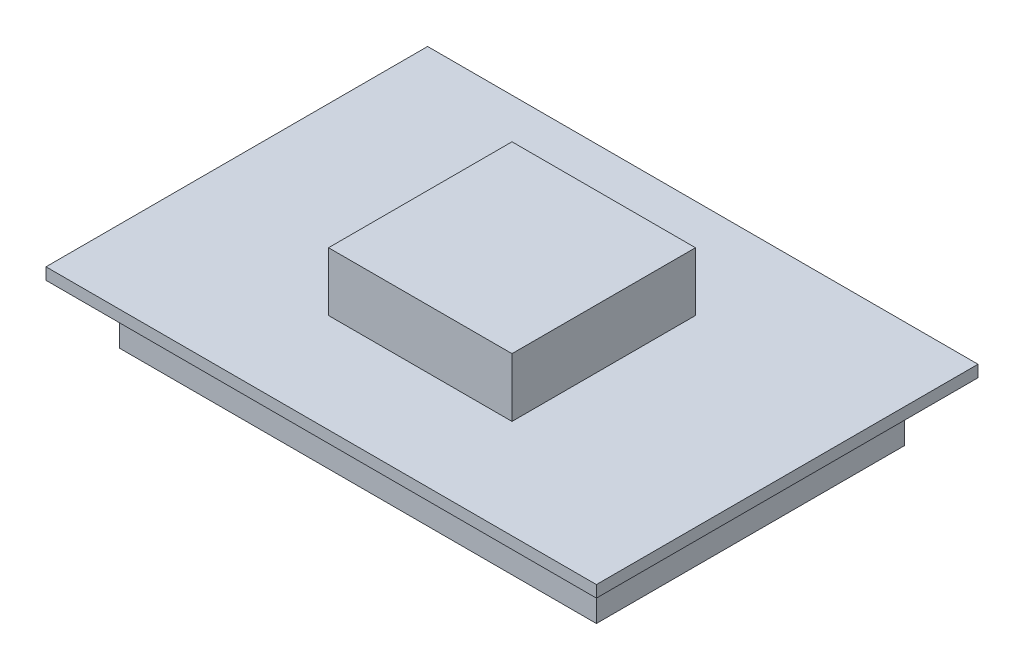
ISO-10303-21;
HEADER;
FILE_DESCRIPTION(('STEP AP214'),'2;1');
FILE_NAME('part.step','',(''),(''),'','','');
FILE_SCHEMA(('AUTOMOTIVE_DESIGN { 1 0 10303 214 1 1 1 1 }'));
ENDSEC;
DATA;
#1=APPLICATION_CONTEXT('core data for automotive mechanical design processes');
#2=APPLICATION_PROTOCOL_DEFINITION('international standard','automotive_design',2000,#1);
#3=PRODUCT_CONTEXT('',#1,'mechanical');
#4=PRODUCT('Part','Part','',(#3));
#5=PRODUCT_RELATED_PRODUCT_CATEGORY('part','',(#4));
#6=PRODUCT_DEFINITION_FORMATION('','',#4);
#7=PRODUCT_DEFINITION_CONTEXT('part definition',#1,'design');
#8=PRODUCT_DEFINITION('design','',#6,#7);
#9=PRODUCT_DEFINITION_SHAPE('','',#8);
#10=(LENGTH_UNIT() NAMED_UNIT(*) SI_UNIT(.MILLI.,.METRE.));
#11=(NAMED_UNIT(*) PLANE_ANGLE_UNIT() SI_UNIT($,.RADIAN.));
#12=(NAMED_UNIT(*) SI_UNIT($,.STERADIAN.) SOLID_ANGLE_UNIT());
#13=UNCERTAINTY_MEASURE_WITH_UNIT(LENGTH_MEASURE(1.E-05),#10,'distance_accuracy_value','');
#14=(GEOMETRIC_REPRESENTATION_CONTEXT(3) GLOBAL_UNCERTAINTY_ASSIGNED_CONTEXT((#13)) GLOBAL_UNIT_ASSIGNED_CONTEXT((#10,
#11,#12)) REPRESENTATION_CONTEXT('',''));
#15=CARTESIAN_POINT('',(0.,0.,0.));
#16=DIRECTION('',(0.,0.,1.));
#17=DIRECTION('',(1.,0.,0.));
#18=AXIS2_PLACEMENT_3D('',#15,#16,#17);
#19=CARTESIAN_POINT('',(-46.,-12.4,97.));
#20=DIRECTION('',(1.,0.,0.));
#21=DIRECTION('',(0.,0.,-1.));
#22=AXIS2_PLACEMENT_3D('',#19,#20,#21);
#23=PLANE('',#22);
#24=DIRECTION('',(0.,0.,1.));
#25=VECTOR('',#24,1.);
#26=CARTESIAN_POINT('',(-46.,-14.,97.));
#27=LINE('',#26,#25);
#28=CARTESIAN_POINT('',(-46.,-14.,97.));
#29=VERTEX_POINT('',#28);
#30=CARTESIAN_POINT('',(-46.,-14.,149.));
#31=VERTEX_POINT('',#30);
#32=EDGE_CURVE('E196',#29,#31,#27,.T.);
#33=ORIENTED_EDGE('',*,*,#32,.T.);
#34=DIRECTION('',(0.,-1.,0.));
#35=VECTOR('',#34,1.);
#36=CARTESIAN_POINT('',(-46.,-12.4,149.));
#37=LINE('',#36,#35);
#38=CARTESIAN_POINT('',(-46.,-12.4,149.));
#39=VERTEX_POINT('',#38);
#40=EDGE_CURVE('E11',#39,#31,#37,.T.);
#41=ORIENTED_EDGE('',*,*,#40,.F.);
#42=DIRECTION('',(0.,0.,1.));
#43=VECTOR('',#42,1.);
#44=CARTESIAN_POINT('',(-46.,-12.4,97.));
#45=LINE('',#44,#43);
#46=CARTESIAN_POINT('',(-46.,-12.4,97.));
#47=VERTEX_POINT('',#46);
#48=EDGE_CURVE('E197',#47,#39,#45,.T.);
#49=ORIENTED_EDGE('',*,*,#48,.F.);
#50=DIRECTION('',(0.,-1.,0.));
#51=VECTOR('',#50,1.);
#52=CARTESIAN_POINT('',(-46.,-12.4,97.));
#53=LINE('',#52,#51);
#54=EDGE_CURVE('E207',#47,#29,#53,.T.);
#55=ORIENTED_EDGE('',*,*,#54,.T.);
#56=EDGE_LOOP('',(#33,#41,#49,#55));
#57=FACE_BOUND('',#56,.T.);
#58=ADVANCED_FACE('F39',(#57),#23,.F.);
#59=CARTESIAN_POINT('',(-46.,-12.4,149.));
#60=DIRECTION('',(0.,0.,-1.));
#61=DIRECTION('',(-1.,0.,0.));
#62=AXIS2_PLACEMENT_3D('',#59,#60,#61);
#63=PLANE('',#62);
#64=DIRECTION('',(1.,0.,0.));
#65=VECTOR('',#64,1.);
#66=CARTESIAN_POINT('',(-46.,-14.,149.));
#67=LINE('',#66,#65);
#68=CARTESIAN_POINT('',(29.,-14.,149.));
#69=VERTEX_POINT('',#68);
#70=EDGE_CURVE('E210',#31,#69,#67,.T.);
#71=ORIENTED_EDGE('',*,*,#70,.T.);
#72=DIRECTION('',(0.,-1.,0.));
#73=VECTOR('',#72,1.);
#74=CARTESIAN_POINT('',(29.,-12.4,149.));
#75=LINE('',#74,#73);
#76=CARTESIAN_POINT('',(29.,-12.4,149.));
#77=VERTEX_POINT('',#76);
#78=EDGE_CURVE('E46',#77,#69,#75,.T.);
#79=ORIENTED_EDGE('',*,*,#78,.F.);
#80=DIRECTION('',(1.,0.,0.));
#81=VECTOR('',#80,1.);
#82=CARTESIAN_POINT('',(-46.,-12.4,149.));
#83=LINE('',#82,#81);
#84=EDGE_CURVE('E200',#39,#77,#83,.T.);
#85=ORIENTED_EDGE('',*,*,#84,.F.);
#86=ORIENTED_EDGE('',*,*,#40,.T.);
#87=EDGE_LOOP('',(#71,#79,#85,#86));
#88=FACE_BOUND('',#87,.T.);
#89=ADVANCED_FACE('F238',(#88),#63,.F.);
#90=CARTESIAN_POINT('',(29.,-12.4,149.));
#91=DIRECTION('',(-1.,0.,0.));
#92=DIRECTION('',(0.,0.,1.));
#93=AXIS2_PLACEMENT_3D('',#90,#91,#92);
#94=PLANE('',#93);
#95=DIRECTION('',(0.,0.,-1.));
#96=VECTOR('',#95,1.);
#97=CARTESIAN_POINT('',(29.,-14.,149.));
#98=LINE('',#97,#96);
#99=CARTESIAN_POINT('',(29.,-14.,97.));
#100=VERTEX_POINT('',#99);
#101=EDGE_CURVE('E212',#69,#100,#98,.T.);
#102=ORIENTED_EDGE('',*,*,#101,.T.);
#103=DIRECTION('',(0.,-1.,0.));
#104=VECTOR('',#103,1.);
#105=CARTESIAN_POINT('',(29.,-12.4,97.));
#106=LINE('',#105,#104);
#107=CARTESIAN_POINT('',(29.,-12.4,97.));
#108=VERTEX_POINT('',#107);
#109=EDGE_CURVE('E217',#108,#100,#106,.T.);
#110=ORIENTED_EDGE('',*,*,#109,.F.);
#111=DIRECTION('',(0.,0.,-1.));
#112=VECTOR('',#111,1.);
#113=CARTESIAN_POINT('',(29.,-12.4,149.));
#114=LINE('',#113,#112);
#115=EDGE_CURVE('E203',#77,#108,#114,.T.);
#116=ORIENTED_EDGE('',*,*,#115,.F.);
#117=ORIENTED_EDGE('',*,*,#78,.T.);
#118=EDGE_LOOP('',(#102,#110,#116,#117));
#119=FACE_BOUND('',#118,.T.);
#120=ADVANCED_FACE('F224',(#119),#94,.F.);
#121=CARTESIAN_POINT('',(29.,-12.4,97.));
#122=DIRECTION('',(0.,0.,1.));
#123=DIRECTION('',(1.,0.,0.));
#124=AXIS2_PLACEMENT_3D('',#121,#122,#123);
#125=PLANE('',#124);
#126=DIRECTION('',(-1.,0.,0.));
#127=VECTOR('',#126,1.);
#128=CARTESIAN_POINT('',(29.,-14.,97.));
#129=LINE('',#128,#127);
#130=EDGE_CURVE('E201',#100,#29,#129,.T.);
#131=ORIENTED_EDGE('',*,*,#130,.T.);
#132=ORIENTED_EDGE('',*,*,#54,.F.);
#133=DIRECTION('',(-1.,0.,0.));
#134=VECTOR('',#133,1.);
#135=CARTESIAN_POINT('',(29.,-12.4,97.));
#136=LINE('',#135,#134);
#137=EDGE_CURVE('E205',#108,#47,#136,.T.);
#138=ORIENTED_EDGE('',*,*,#137,.F.);
#139=ORIENTED_EDGE('',*,*,#109,.T.);
#140=EDGE_LOOP('',(#131,#132,#138,#139));
#141=FACE_BOUND('',#140,.T.);
#142=ADVANCED_FACE('F231',(#141),#125,.F.);
#143=CARTESIAN_POINT('',(0.,-12.4,0.));
#144=DIRECTION('',(0.,1.,0.));
#145=DIRECTION('',(0.,0.,1.));
#146=AXIS2_PLACEMENT_3D('',#143,#144,#145);
#147=PLANE('',#146);
#148=DIRECTION('',(0.,0.,1.));
#149=VECTOR('',#148,1.);
#150=CARTESIAN_POINT('',(-21.,-12.4,110.5));
#151=LINE('',#150,#149);
#152=CARTESIAN_POINT('',(-21.,-12.4,110.5));
#153=VERTEX_POINT('',#152);
#154=CARTESIAN_POINT('',(-21.,-12.4,135.5));
#155=VERTEX_POINT('',#154);
#156=EDGE_CURVE('E61',#153,#155,#151,.T.);
#157=ORIENTED_EDGE('',*,*,#156,.F.);
#158=DIRECTION('',(-1.,0.,0.));
#159=VECTOR('',#158,1.);
#160=CARTESIAN_POINT('',(4.,-12.4,110.5));
#161=LINE('',#160,#159);
#162=CARTESIAN_POINT('',(4.,-12.4,110.5));
#163=VERTEX_POINT('',#162);
#164=EDGE_CURVE('E170',#163,#153,#161,.T.);
#165=ORIENTED_EDGE('',*,*,#164,.F.);
#166=DIRECTION('',(0.,0.,-1.));
#167=VECTOR('',#166,1.);
#168=CARTESIAN_POINT('',(4.,-12.4,135.5));
#169=LINE('',#168,#167);
#170=CARTESIAN_POINT('',(4.,-12.4,135.5));
#171=VERTEX_POINT('',#170);
#172=EDGE_CURVE('E181',#171,#163,#169,.T.);
#173=ORIENTED_EDGE('',*,*,#172,.F.);
#174=DIRECTION('',(1.,0.,0.));
#175=VECTOR('',#174,1.);
#176=CARTESIAN_POINT('',(-21.,-12.4,135.5));
#177=LINE('',#176,#175);
#178=EDGE_CURVE('E178',#155,#171,#177,.T.);
#179=ORIENTED_EDGE('',*,*,#178,.F.);
#180=EDGE_LOOP('',(#157,#165,#173,#179));
#181=FACE_BOUND('',#180,.T.);
#182=ORIENTED_EDGE('',*,*,#48,.T.);
#183=ORIENTED_EDGE('',*,*,#84,.T.);
#184=ORIENTED_EDGE('',*,*,#115,.T.);
#185=ORIENTED_EDGE('',*,*,#137,.T.);
#186=EDGE_LOOP('',(#182,#183,#184,#185));
#187=FACE_BOUND('',#186,.T.);
#188=ADVANCED_FACE('F237',(#181,#187),#147,.T.);
#189=CARTESIAN_POINT('',(0.,-14.,0.));
#190=DIRECTION('',(0.,1.,0.));
#191=DIRECTION('',(0.,0.,1.));
#192=AXIS2_PLACEMENT_3D('',#189,#190,#191);
#193=PLANE('',#192);
#194=DIRECTION('',(-1.,0.,0.));
#195=VECTOR('',#194,1.);
#196=CARTESIAN_POINT('',(24.,-14.,102.));
#197=LINE('',#196,#195);
#198=CARTESIAN_POINT('',(24.,-14.,102.));
#199=VERTEX_POINT('',#198);
#200=CARTESIAN_POINT('',(-41.,-14.,102.));
#201=VERTEX_POINT('',#200);
#202=EDGE_CURVE('E148',#199,#201,#197,.T.);
#203=ORIENTED_EDGE('',*,*,#202,.T.);
#204=DIRECTION('',(0.,0.,1.));
#205=VECTOR('',#204,1.);
#206=CARTESIAN_POINT('',(-41.,-14.,102.));
#207=LINE('',#206,#205);
#208=CARTESIAN_POINT('',(-41.,-14.,144.));
#209=VERTEX_POINT('',#208);
#210=EDGE_CURVE('E53',#201,#209,#207,.T.);
#211=ORIENTED_EDGE('',*,*,#210,.T.);
#212=DIRECTION('',(1.,0.,0.));
#213=VECTOR('',#212,1.);
#214=CARTESIAN_POINT('',(-41.,-14.,144.));
#215=LINE('',#214,#213);
#216=CARTESIAN_POINT('',(24.,-14.,144.));
#217=VERTEX_POINT('',#216);
#218=EDGE_CURVE('E129',#209,#217,#215,.T.);
#219=ORIENTED_EDGE('',*,*,#218,.T.);
#220=DIRECTION('',(0.,0.,-1.));
#221=VECTOR('',#220,1.);
#222=CARTESIAN_POINT('',(24.,-14.,144.));
#223=LINE('',#222,#221);
#224=EDGE_CURVE('E138',#217,#199,#223,.T.);
#225=ORIENTED_EDGE('',*,*,#224,.T.);
#226=EDGE_LOOP('',(#203,#211,#219,#225));
#227=FACE_BOUND('',#226,.T.);
#228=ORIENTED_EDGE('',*,*,#32,.F.);
#229=ORIENTED_EDGE('',*,*,#130,.F.);
#230=ORIENTED_EDGE('',*,*,#101,.F.);
#231=ORIENTED_EDGE('',*,*,#70,.F.);
#232=EDGE_LOOP('',(#228,#229,#230,#231));
#233=FACE_BOUND('',#232,.T.);
#234=ADVANCED_FACE('F145',(#227,#233),#193,.F.);
#235=CARTESIAN_POINT('',(-21.,-4.4,110.5));
#236=DIRECTION('',(1.,0.,0.));
#237=DIRECTION('',(0.,0.,-1.));
#238=AXIS2_PLACEMENT_3D('',#235,#236,#237);
#239=PLANE('',#238);
#240=ORIENTED_EDGE('',*,*,#156,.T.);
#241=DIRECTION('',(0.,-1.,0.));
#242=VECTOR('',#241,1.);
#243=CARTESIAN_POINT('',(-21.,-4.4,135.5));
#244=LINE('',#243,#242);
#245=CARTESIAN_POINT('',(-21.,-4.4,135.5));
#246=VERTEX_POINT('',#245);
#247=EDGE_CURVE('E193',#246,#155,#244,.T.);
#248=ORIENTED_EDGE('',*,*,#247,.F.);
#249=DIRECTION('',(0.,0.,1.));
#250=VECTOR('',#249,1.);
#251=CARTESIAN_POINT('',(-21.,-4.4,110.5));
#252=LINE('',#251,#250);
#253=CARTESIAN_POINT('',(-21.,-4.4,110.5));
#254=VERTEX_POINT('',#253);
#255=EDGE_CURVE('E166',#254,#246,#252,.T.);
#256=ORIENTED_EDGE('',*,*,#255,.F.);
#257=DIRECTION('',(0.,-1.,0.));
#258=VECTOR('',#257,1.);
#259=CARTESIAN_POINT('',(-21.,-4.4,110.5));
#260=LINE('',#259,#258);
#261=EDGE_CURVE('E176',#254,#153,#260,.T.);
#262=ORIENTED_EDGE('',*,*,#261,.T.);
#263=EDGE_LOOP('',(#240,#248,#256,#262));
#264=FACE_BOUND('',#263,.T.);
#265=ADVANCED_FACE('F250',(#264),#239,.F.);
#266=CARTESIAN_POINT('',(-21.,-4.4,135.5));
#267=DIRECTION('',(0.,0.,-1.));
#268=DIRECTION('',(-1.,0.,0.));
#269=AXIS2_PLACEMENT_3D('',#266,#267,#268);
#270=PLANE('',#269);
#271=ORIENTED_EDGE('',*,*,#178,.T.);
#272=DIRECTION('',(0.,-1.,0.));
#273=VECTOR('',#272,1.);
#274=CARTESIAN_POINT('',(4.,-4.4,135.5));
#275=LINE('',#274,#273);
#276=CARTESIAN_POINT('',(4.,-4.4,135.5));
#277=VERTEX_POINT('',#276);
#278=EDGE_CURVE('E190',#277,#171,#275,.T.);
#279=ORIENTED_EDGE('',*,*,#278,.F.);
#280=DIRECTION('',(1.,0.,0.));
#281=VECTOR('',#280,1.);
#282=CARTESIAN_POINT('',(-21.,-4.4,135.5));
#283=LINE('',#282,#281);
#284=EDGE_CURVE('E169',#246,#277,#283,.T.);
#285=ORIENTED_EDGE('',*,*,#284,.F.);
#286=ORIENTED_EDGE('',*,*,#247,.T.);
#287=EDGE_LOOP('',(#271,#279,#285,#286));
#288=FACE_BOUND('',#287,.T.);
#289=ADVANCED_FACE('F255',(#288),#270,.F.);
#290=CARTESIAN_POINT('',(4.,-4.4,135.5));
#291=DIRECTION('',(-1.,0.,0.));
#292=DIRECTION('',(0.,0.,1.));
#293=AXIS2_PLACEMENT_3D('',#290,#291,#292);
#294=PLANE('',#293);
#295=ORIENTED_EDGE('',*,*,#172,.T.);
#296=DIRECTION('',(0.,-1.,0.));
#297=VECTOR('',#296,1.);
#298=CARTESIAN_POINT('',(4.,-4.4,110.5));
#299=LINE('',#298,#297);
#300=CARTESIAN_POINT('',(4.,-4.4,110.5));
#301=VERTEX_POINT('',#300);
#302=EDGE_CURVE('E187',#301,#163,#299,.T.);
#303=ORIENTED_EDGE('',*,*,#302,.F.);
#304=DIRECTION('',(0.,0.,-1.));
#305=VECTOR('',#304,1.);
#306=CARTESIAN_POINT('',(4.,-4.4,135.5));
#307=LINE('',#306,#305);
#308=EDGE_CURVE('E172',#277,#301,#307,.T.);
#309=ORIENTED_EDGE('',*,*,#308,.F.);
#310=ORIENTED_EDGE('',*,*,#278,.T.);
#311=EDGE_LOOP('',(#295,#303,#309,#310));
#312=FACE_BOUND('',#311,.T.);
#313=ADVANCED_FACE('F259',(#312),#294,.F.);
#314=CARTESIAN_POINT('',(4.,-4.4,110.5));
#315=DIRECTION('',(0.,0.,1.));
#316=DIRECTION('',(1.,0.,0.));
#317=AXIS2_PLACEMENT_3D('',#314,#315,#316);
#318=PLANE('',#317);
#319=ORIENTED_EDGE('',*,*,#164,.T.);
#320=ORIENTED_EDGE('',*,*,#261,.F.);
#321=DIRECTION('',(-1.,0.,0.));
#322=VECTOR('',#321,1.);
#323=CARTESIAN_POINT('',(4.,-4.4,110.5));
#324=LINE('',#323,#322);
#325=EDGE_CURVE('E174',#301,#254,#324,.T.);
#326=ORIENTED_EDGE('',*,*,#325,.F.);
#327=ORIENTED_EDGE('',*,*,#302,.T.);
#328=EDGE_LOOP('',(#319,#320,#326,#327));
#329=FACE_BOUND('',#328,.T.);
#330=ADVANCED_FACE('F263',(#329),#318,.F.);
#331=CARTESIAN_POINT('',(0.,-4.4,0.));
#332=DIRECTION('',(0.,1.,0.));
#333=DIRECTION('',(0.,0.,1.));
#334=AXIS2_PLACEMENT_3D('',#331,#332,#333);
#335=PLANE('',#334);
#336=ORIENTED_EDGE('',*,*,#255,.T.);
#337=ORIENTED_EDGE('',*,*,#284,.T.);
#338=ORIENTED_EDGE('',*,*,#308,.T.);
#339=ORIENTED_EDGE('',*,*,#325,.T.);
#340=EDGE_LOOP('',(#336,#337,#338,#339));
#341=FACE_BOUND('',#340,.T.);
#342=ADVANCED_FACE('F267',(#341),#335,.T.);
#343=CARTESIAN_POINT('',(-41.,-14.,102.));
#344=DIRECTION('',(1.,0.,0.));
#345=DIRECTION('',(0.,0.,-1.));
#346=AXIS2_PLACEMENT_3D('',#343,#344,#345);
#347=PLANE('',#346);
#348=DIRECTION('',(0.,0.,1.));
#349=VECTOR('',#348,1.);
#350=CARTESIAN_POINT('',(-41.,-22.,102.));
#351=LINE('',#350,#349);
#352=CARTESIAN_POINT('',(-41.,-22.,102.));
#353=VERTEX_POINT('',#352);
#354=CARTESIAN_POINT('',(-41.,-22.,144.));
#355=VERTEX_POINT('',#354);
#356=EDGE_CURVE('E142',#353,#355,#351,.T.);
#357=ORIENTED_EDGE('',*,*,#356,.T.);
#358=DIRECTION('',(0.,-1.,0.));
#359=VECTOR('',#358,1.);
#360=CARTESIAN_POINT('',(-41.,-14.,144.));
#361=LINE('',#360,#359);
#362=EDGE_CURVE('E131',#209,#355,#361,.T.);
#363=ORIENTED_EDGE('',*,*,#362,.F.);
#364=ORIENTED_EDGE('',*,*,#210,.F.);
#365=DIRECTION('',(0.,-1.,0.));
#366=VECTOR('',#365,1.);
#367=CARTESIAN_POINT('',(-41.,-14.,102.));
#368=LINE('',#367,#366);
#369=EDGE_CURVE('E156',#201,#353,#368,.T.);
#370=ORIENTED_EDGE('',*,*,#369,.T.);
#371=EDGE_LOOP('',(#357,#363,#364,#370));
#372=FACE_BOUND('',#371,.T.);
#373=ADVANCED_FACE('F140',(#372),#347,.F.);
#374=CARTESIAN_POINT('',(-41.,-14.,144.));
#375=DIRECTION('',(0.,0.,-1.));
#376=DIRECTION('',(-1.,0.,0.));
#377=AXIS2_PLACEMENT_3D('',#374,#375,#376);
#378=PLANE('',#377);
#379=DIRECTION('',(1.,0.,0.));
#380=VECTOR('',#379,1.);
#381=CARTESIAN_POINT('',(-41.,-22.,144.));
#382=LINE('',#381,#380);
#383=CARTESIAN_POINT('',(24.,-22.,144.));
#384=VERTEX_POINT('',#383);
#385=EDGE_CURVE('E158',#355,#384,#382,.T.);
#386=ORIENTED_EDGE('',*,*,#385,.T.);
#387=DIRECTION('',(0.,-1.,0.));
#388=VECTOR('',#387,1.);
#389=CARTESIAN_POINT('',(24.,-14.,144.));
#390=LINE('',#389,#388);
#391=EDGE_CURVE('E134',#217,#384,#390,.T.);
#392=ORIENTED_EDGE('',*,*,#391,.F.);
#393=ORIENTED_EDGE('',*,*,#218,.F.);
#394=ORIENTED_EDGE('',*,*,#362,.T.);
#395=EDGE_LOOP('',(#386,#392,#393,#394));
#396=FACE_BOUND('',#395,.T.);
#397=ADVANCED_FACE('F130',(#396),#378,.F.);
#398=CARTESIAN_POINT('',(24.,-14.,144.));
#399=DIRECTION('',(-1.,0.,0.));
#400=DIRECTION('',(0.,0.,1.));
#401=AXIS2_PLACEMENT_3D('',#398,#399,#400);
#402=PLANE('',#401);
#403=DIRECTION('',(0.,0.,-1.));
#404=VECTOR('',#403,1.);
#405=CARTESIAN_POINT('',(24.,-22.,144.));
#406=LINE('',#405,#404);
#407=CARTESIAN_POINT('',(24.,-22.,102.));
#408=VERTEX_POINT('',#407);
#409=EDGE_CURVE('E151',#384,#408,#406,.T.);
#410=ORIENTED_EDGE('',*,*,#409,.T.);
#411=DIRECTION('',(0.,-1.,0.));
#412=VECTOR('',#411,1.);
#413=CARTESIAN_POINT('',(24.,-14.,102.));
#414=LINE('',#413,#412);
#415=EDGE_CURVE('E162',#199,#408,#414,.T.);
#416=ORIENTED_EDGE('',*,*,#415,.F.);
#417=ORIENTED_EDGE('',*,*,#224,.F.);
#418=ORIENTED_EDGE('',*,*,#391,.T.);
#419=EDGE_LOOP('',(#410,#416,#417,#418));
#420=FACE_BOUND('',#419,.T.);
#421=ADVANCED_FACE('F276',(#420),#402,.F.);
#422=CARTESIAN_POINT('',(24.,-14.,102.));
#423=DIRECTION('',(0.,0.,1.));
#424=DIRECTION('',(1.,0.,0.));
#425=AXIS2_PLACEMENT_3D('',#422,#423,#424);
#426=PLANE('',#425);
#427=DIRECTION('',(-1.,0.,0.));
#428=VECTOR('',#427,1.);
#429=CARTESIAN_POINT('',(24.,-22.,102.));
#430=LINE('',#429,#428);
#431=EDGE_CURVE('E149',#408,#353,#430,.T.);
#432=ORIENTED_EDGE('',*,*,#431,.T.);
#433=ORIENTED_EDGE('',*,*,#369,.F.);
#434=ORIENTED_EDGE('',*,*,#202,.F.);
#435=ORIENTED_EDGE('',*,*,#415,.T.);
#436=EDGE_LOOP('',(#432,#433,#434,#435));
#437=FACE_BOUND('',#436,.T.);
#438=ADVANCED_FACE('F279',(#437),#426,.F.);
#439=CARTESIAN_POINT('',(0.,-22.,0.));
#440=DIRECTION('',(0.,1.,0.));
#441=DIRECTION('',(0.,0.,1.));
#442=AXIS2_PLACEMENT_3D('',#439,#440,#441);
#443=PLANE('',#442);
#444=ORIENTED_EDGE('',*,*,#356,.F.);
#445=ORIENTED_EDGE('',*,*,#431,.F.);
#446=ORIENTED_EDGE('',*,*,#409,.F.);
#447=ORIENTED_EDGE('',*,*,#385,.F.);
#448=EDGE_LOOP('',(#444,#445,#446,#447));
#449=FACE_BOUND('',#448,.T.);
#450=ADVANCED_FACE('F283',(#449),#443,.F.);
#451=CLOSED_SHELL('',(#58,#89,#120,#142,#188,#234,#265,#289,#313,#330,#342,#373,#397,#421,#438,#450));
#452=MANIFOLD_SOLID_BREP('B2',#451);
#453=ADVANCED_BREP_SHAPE_REPRESENTATION('',(#18,#452),#14);
#454=SHAPE_DEFINITION_REPRESENTATION(#9,#453);
ENDSEC;
END-ISO-10303-21;
